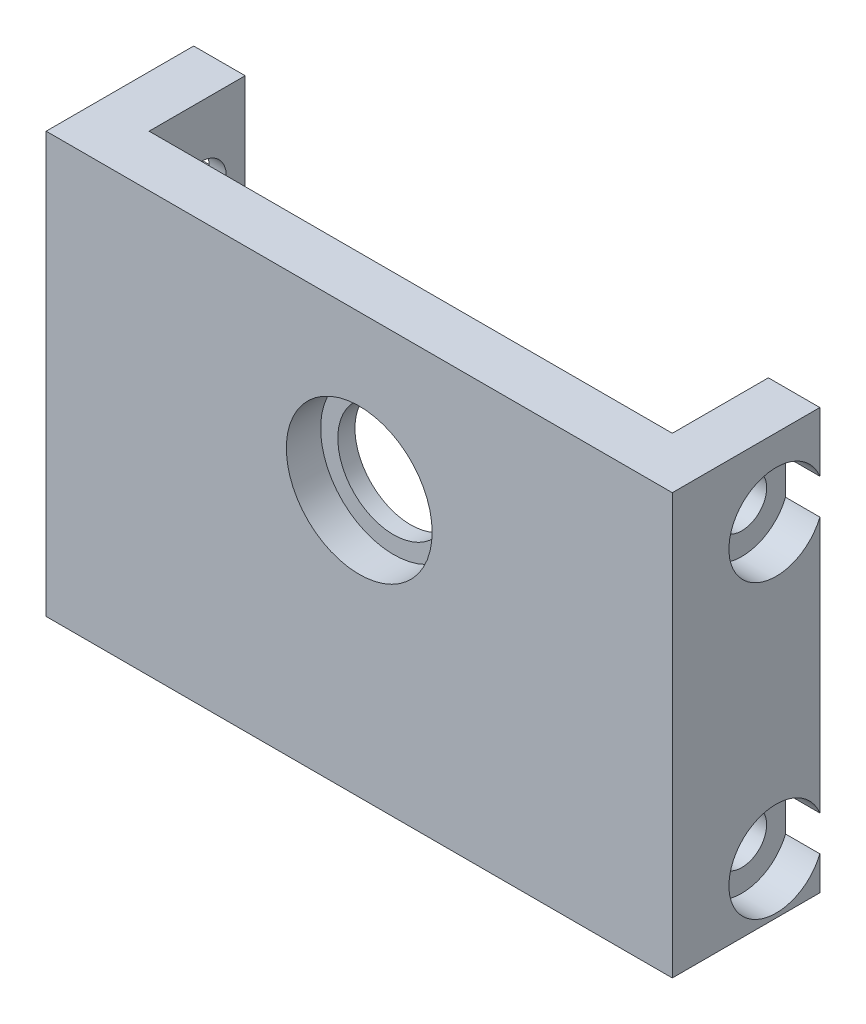
ISO-10303-21;
HEADER;
FILE_DESCRIPTION(('STEP AP214'),'2;1');
FILE_NAME('part.step','',(''),(''),'','','');
FILE_SCHEMA(('AUTOMOTIVE_DESIGN { 1 0 10303 214 1 1 1 1 }'));
ENDSEC;
DATA;
#1=APPLICATION_CONTEXT('core data for automotive mechanical design processes');
#2=APPLICATION_PROTOCOL_DEFINITION('international standard','automotive_design',2000,#1);
#3=PRODUCT_CONTEXT('',#1,'mechanical');
#4=PRODUCT('Part','Part','',(#3));
#5=PRODUCT_RELATED_PRODUCT_CATEGORY('part','',(#4));
#6=PRODUCT_DEFINITION_FORMATION('','',#4);
#7=PRODUCT_DEFINITION_CONTEXT('part definition',#1,'design');
#8=PRODUCT_DEFINITION('design','',#6,#7);
#9=PRODUCT_DEFINITION_SHAPE('','',#8);
#10=(LENGTH_UNIT() NAMED_UNIT(*) SI_UNIT(.MILLI.,.METRE.));
#11=(NAMED_UNIT(*) PLANE_ANGLE_UNIT() SI_UNIT($,.RADIAN.));
#12=(NAMED_UNIT(*) SI_UNIT($,.STERADIAN.) SOLID_ANGLE_UNIT());
#13=UNCERTAINTY_MEASURE_WITH_UNIT(LENGTH_MEASURE(1.E-05),#10,'distance_accuracy_value','');
#14=(GEOMETRIC_REPRESENTATION_CONTEXT(3) GLOBAL_UNCERTAINTY_ASSIGNED_CONTEXT((#13)) GLOBAL_UNIT_ASSIGNED_CONTEXT((#10,
#11,#12)) REPRESENTATION_CONTEXT('',''));
#15=CARTESIAN_POINT('',(0.,0.,0.));
#16=DIRECTION('',(0.,0.,1.));
#17=DIRECTION('',(1.,0.,0.));
#18=AXIS2_PLACEMENT_3D('',#15,#16,#17);
#19=CARTESIAN_POINT('',(33.25,0.,0.));
#20=DIRECTION('',(-1.,0.,0.));
#21=DIRECTION('',(0.,1.,0.));
#22=AXIS2_PLACEMENT_3D('',#19,#20,#21);
#23=PLANE('',#22);
#24=DIRECTION('',(0.,-1.,0.));
#25=VECTOR('',#24,1.);
#26=CARTESIAN_POINT('',(33.25,3.00000000000002,-5.34999999999999));
#27=LINE('',#26,#25);
#28=CARTESIAN_POINT('',(33.25,-2.52956301409871,-5.34999999999999));
#29=VERTEX_POINT('',#28);
#30=CARTESIAN_POINT('',(33.25,-17.4704369859013,-5.34999999999999));
#31=VERTEX_POINT('',#30);
#32=EDGE_CURVE('E59',#29,#31,#27,.T.);
#33=ORIENTED_EDGE('',*,*,#32,.F.);
#34=CARTESIAN_POINT('',(33.25,-1.50000000000002,-2.79999999999999));
#35=DIRECTION('',(1.,0.,0.));
#36=DIRECTION('',(0.,0.,-1.));
#37=AXIS2_PLACEMENT_3D('',#34,#35,#36);
#38=CIRCLE('',#37,2.75);
#39=CARTESIAN_POINT('',(33.25,-0.470436985901324,-5.34999999999999));
#40=VERTEX_POINT('',#39);
#41=EDGE_CURVE('E52',#40,#29,#38,.T.);
#42=ORIENTED_EDGE('',*,*,#41,.F.);
#43=CARTESIAN_POINT('',(33.25,3.00000000000002,-5.34999999999999));
#44=VERTEX_POINT('',#43);
#45=EDGE_CURVE('E163',#44,#40,#27,.T.);
#46=ORIENTED_EDGE('',*,*,#45,.F.);
#47=DIRECTION('',(0.,0.,-1.));
#48=VECTOR('',#47,1.);
#49=CARTESIAN_POINT('',(33.25,3.00000000000002,3.25));
#50=LINE('',#49,#48);
#51=CARTESIAN_POINT('',(33.25,3.00000000000002,3.25));
#52=VERTEX_POINT('',#51);
#53=EDGE_CURVE('E170',#52,#44,#50,.T.);
#54=ORIENTED_EDGE('',*,*,#53,.F.);
#55=DIRECTION('',(0.,1.,0.));
#56=VECTOR('',#55,1.);
#57=CARTESIAN_POINT('',(33.25,3.00000000000002,3.25));
#58=LINE('',#57,#56);
#59=CARTESIAN_POINT('',(33.25,-21.4999999999988,3.25));
#60=VERTEX_POINT('',#59);
#61=EDGE_CURVE('E180',#60,#52,#58,.T.);
#62=ORIENTED_EDGE('',*,*,#61,.F.);
#63=DIRECTION('',(0.,0.,1.));
#64=VECTOR('',#63,1.);
#65=CARTESIAN_POINT('',(33.25,-21.4999999999988,3.25));
#66=LINE('',#65,#64);
#67=CARTESIAN_POINT('',(33.25,-21.4999999999988,-5.34999999999999));
#68=VERTEX_POINT('',#67);
#69=EDGE_CURVE('E175',#68,#60,#66,.T.);
#70=ORIENTED_EDGE('',*,*,#69,.F.);
#71=CARTESIAN_POINT('',(33.25,-19.5295630140987,-5.34999999999999));
#72=VERTEX_POINT('',#71);
#73=EDGE_CURVE('E172',#72,#68,#27,.T.);
#74=ORIENTED_EDGE('',*,*,#73,.F.);
#75=CARTESIAN_POINT('',(33.25,-18.5,-2.79999999999999));
#76=DIRECTION('',(1.,0.,0.));
#77=DIRECTION('',(0.,0.,-1.));
#78=AXIS2_PLACEMENT_3D('',#75,#76,#77);
#79=CIRCLE('',#78,2.75);
#80=EDGE_CURVE('E234',#31,#72,#79,.T.);
#81=ORIENTED_EDGE('',*,*,#80,.F.);
#82=EDGE_LOOP('',(#33,#42,#46,#54,#62,#70,#74,#81));
#83=FACE_BOUND('',#82,.T.);
#84=ADVANCED_FACE('F38',(#83),#23,.F.);
#85=CARTESIAN_POINT('',(-3.25,0.,0.));
#86=DIRECTION('',(1.,0.,0.));
#87=DIRECTION('',(0.,1.,0.));
#88=AXIS2_PLACEMENT_3D('',#85,#86,#87);
#89=PLANE('',#88);
#90=DIRECTION('',(0.,-1.,0.));
#91=VECTOR('',#90,1.);
#92=CARTESIAN_POINT('',(-3.25,3.00000000000002,-5.34999999999999));
#93=LINE('',#92,#91);
#94=CARTESIAN_POINT('',(-3.25,3.00000000000002,-5.34999999999999));
#95=VERTEX_POINT('',#94);
#96=CARTESIAN_POINT('',(-3.25,-0.470436985901327,-5.34999999999999));
#97=VERTEX_POINT('',#96);
#98=EDGE_CURVE('E377',#95,#97,#93,.T.);
#99=ORIENTED_EDGE('',*,*,#98,.T.);
#100=CARTESIAN_POINT('',(-3.25,-1.50000000000001,-2.79999999999999));
#101=DIRECTION('',(-1.,0.,0.));
#102=DIRECTION('',(0.,0.,1.));
#103=AXIS2_PLACEMENT_3D('',#100,#101,#102);
#104=CIRCLE('',#103,2.75);
#105=CARTESIAN_POINT('',(-3.25,-2.52956301409871,-5.34999999999999));
#106=VERTEX_POINT('',#105);
#107=EDGE_CURVE('E219',#106,#97,#104,.T.);
#108=ORIENTED_EDGE('',*,*,#107,.F.);
#109=CARTESIAN_POINT('',(-3.25,-17.4704369859013,-5.34999999999999));
#110=VERTEX_POINT('',#109);
#111=EDGE_CURVE('E378',#106,#110,#93,.T.);
#112=ORIENTED_EDGE('',*,*,#111,.T.);
#113=CARTESIAN_POINT('',(-3.25,-18.5,-2.79999999999999));
#114=DIRECTION('',(-1.,0.,0.));
#115=DIRECTION('',(0.,0.,1.));
#116=AXIS2_PLACEMENT_3D('',#113,#114,#115);
#117=CIRCLE('',#116,2.75);
#118=CARTESIAN_POINT('',(-3.25,-19.5295630140987,-5.34999999999999));
#119=VERTEX_POINT('',#118);
#120=EDGE_CURVE('E207',#119,#110,#117,.T.);
#121=ORIENTED_EDGE('',*,*,#120,.F.);
#122=CARTESIAN_POINT('',(-3.25,-21.4999999999988,-5.34999999999999));
#123=VERTEX_POINT('',#122);
#124=EDGE_CURVE('E375',#119,#123,#93,.T.);
#125=ORIENTED_EDGE('',*,*,#124,.T.);
#126=DIRECTION('',(0.,0.,1.));
#127=VECTOR('',#126,1.);
#128=CARTESIAN_POINT('',(-3.25,-21.4999999999988,3.25));
#129=LINE('',#128,#127);
#130=CARTESIAN_POINT('',(-3.25,-21.4999999999988,3.25));
#131=VERTEX_POINT('',#130);
#132=EDGE_CURVE('E322',#123,#131,#129,.T.);
#133=ORIENTED_EDGE('',*,*,#132,.T.);
#134=DIRECTION('',(0.,1.,0.));
#135=VECTOR('',#134,1.);
#136=CARTESIAN_POINT('',(-3.25,3.00000000000002,3.25));
#137=LINE('',#136,#135);
#138=CARTESIAN_POINT('',(-3.25,3.00000000000002,3.25));
#139=VERTEX_POINT('',#138);
#140=EDGE_CURVE('E326',#131,#139,#137,.T.);
#141=ORIENTED_EDGE('',*,*,#140,.T.);
#142=DIRECTION('',(0.,0.,-1.));
#143=VECTOR('',#142,1.);
#144=CARTESIAN_POINT('',(-3.25,3.00000000000002,3.25));
#145=LINE('',#144,#143);
#146=EDGE_CURVE('E382',#139,#95,#145,.T.);
#147=ORIENTED_EDGE('',*,*,#146,.T.);
#148=EDGE_LOOP('',(#99,#108,#112,#121,#125,#133,#141,#147));
#149=FACE_BOUND('',#148,.T.);
#150=ADVANCED_FACE('F255',(#149),#89,.F.);
#151=CARTESIAN_POINT('',(-0.249999999999998,-21.4999999999988,3.25));
#152=DIRECTION('',(0.,1.,0.));
#153=DIRECTION('',(0.,0.,1.));
#154=AXIS2_PLACEMENT_3D('',#151,#152,#153);
#155=PLANE('',#154);
#156=DIRECTION('',(1.,0.,0.));
#157=VECTOR('',#156,1.);
#158=CARTESIAN_POINT('',(-0.249999999999998,-21.4999999999988,0.25));
#159=LINE('',#158,#157);
#160=CARTESIAN_POINT('',(-0.249999999999998,-21.4999999999988,0.25));
#161=VERTEX_POINT('',#160);
#162=CARTESIAN_POINT('',(30.25,-21.4999999999988,0.25));
#163=VERTEX_POINT('',#162);
#164=EDGE_CURVE('E308',#161,#163,#159,.T.);
#165=ORIENTED_EDGE('',*,*,#164,.T.);
#166=DIRECTION('',(0.,0.,1.));
#167=VECTOR('',#166,1.);
#168=CARTESIAN_POINT('',(30.25,-21.4999999999988,3.25));
#169=LINE('',#168,#167);
#170=CARTESIAN_POINT('',(30.25,-21.4999999999988,-5.34999999999999));
#171=VERTEX_POINT('',#170);
#172=EDGE_CURVE('E190',#171,#163,#169,.T.);
#173=ORIENTED_EDGE('',*,*,#172,.F.);
#174=DIRECTION('',(-1.,0.,0.));
#175=VECTOR('',#174,1.);
#176=CARTESIAN_POINT('',(33.25,-21.4999999999988,-5.34999999999999));
#177=LINE('',#176,#175);
#178=EDGE_CURVE('E316',#68,#171,#177,.T.);
#179=ORIENTED_EDGE('',*,*,#178,.F.);
#180=ORIENTED_EDGE('',*,*,#69,.T.);
#181=DIRECTION('',(1.,0.,0.));
#182=VECTOR('',#181,1.);
#183=CARTESIAN_POINT('',(-0.249999999999998,-21.4999999999988,3.25));
#184=LINE('',#183,#182);
#185=EDGE_CURVE('E303',#131,#60,#184,.T.);
#186=ORIENTED_EDGE('',*,*,#185,.F.);
#187=ORIENTED_EDGE('',*,*,#132,.F.);
#188=DIRECTION('',(1.,0.,0.));
#189=VECTOR('',#188,1.);
#190=CARTESIAN_POINT('',(-3.25,-21.4999999999988,-5.34999999999999));
#191=LINE('',#190,#189);
#192=CARTESIAN_POINT('',(-0.249999999999998,-21.4999999999988,-5.34999999999999));
#193=VERTEX_POINT('',#192);
#194=EDGE_CURVE('E327',#123,#193,#191,.T.);
#195=ORIENTED_EDGE('',*,*,#194,.T.);
#196=DIRECTION('',(0.,0.,1.));
#197=VECTOR('',#196,1.);
#198=CARTESIAN_POINT('',(-0.249999999999998,-21.4999999999988,3.25));
#199=LINE('',#198,#197);
#200=EDGE_CURVE('E318',#193,#161,#199,.T.);
#201=ORIENTED_EDGE('',*,*,#200,.T.);
#202=EDGE_LOOP('',(#165,#173,#179,#180,#186,#187,#195,#201));
#203=FACE_BOUND('',#202,.T.);
#204=ADVANCED_FACE('F40',(#203),#155,.F.);
#205=CARTESIAN_POINT('',(-0.250000000000001,3.00000000000002,3.25));
#206=DIRECTION('',(0.,-1.,0.));
#207=DIRECTION('',(0.,0.,-1.));
#208=AXIS2_PLACEMENT_3D('',#205,#206,#207);
#209=PLANE('',#208);
#210=DIRECTION('',(-1.,0.,0.));
#211=VECTOR('',#210,1.);
#212=CARTESIAN_POINT('',(-0.250000000000001,3.00000000000002,0.25));
#213=LINE('',#212,#211);
#214=CARTESIAN_POINT('',(30.25,3.00000000000002,0.25));
#215=VERTEX_POINT('',#214);
#216=CARTESIAN_POINT('',(-0.250000000000001,3.00000000000002,0.25));
#217=VERTEX_POINT('',#216);
#218=EDGE_CURVE('E294',#215,#217,#213,.T.);
#219=ORIENTED_EDGE('',*,*,#218,.T.);
#220=DIRECTION('',(0.,0.,-1.));
#221=VECTOR('',#220,1.);
#222=CARTESIAN_POINT('',(-0.250000000000001,3.00000000000002,3.25));
#223=LINE('',#222,#221);
#224=CARTESIAN_POINT('',(-0.250000000000001,3.00000000000002,-5.34999999999999));
#225=VERTEX_POINT('',#224);
#226=EDGE_CURVE('E298',#217,#225,#223,.T.);
#227=ORIENTED_EDGE('',*,*,#226,.T.);
#228=DIRECTION('',(1.,0.,0.));
#229=VECTOR('',#228,1.);
#230=CARTESIAN_POINT('',(-3.25,3.00000000000002,-5.34999999999999));
#231=LINE('',#230,#229);
#232=EDGE_CURVE('E312',#95,#225,#231,.T.);
#233=ORIENTED_EDGE('',*,*,#232,.F.);
#234=ORIENTED_EDGE('',*,*,#146,.F.);
#235=DIRECTION('',(-1.,0.,0.));
#236=VECTOR('',#235,1.);
#237=CARTESIAN_POINT('',(-0.250000000000001,3.00000000000002,3.25));
#238=LINE('',#237,#236);
#239=EDGE_CURVE('E332',#52,#139,#238,.T.);
#240=ORIENTED_EDGE('',*,*,#239,.F.);
#241=ORIENTED_EDGE('',*,*,#53,.T.);
#242=DIRECTION('',(-1.,0.,0.));
#243=VECTOR('',#242,1.);
#244=CARTESIAN_POINT('',(33.25,3.00000000000002,-5.34999999999999));
#245=LINE('',#244,#243);
#246=CARTESIAN_POINT('',(30.25,3.00000000000002,-5.34999999999999));
#247=VERTEX_POINT('',#246);
#248=EDGE_CURVE('E166',#44,#247,#245,.T.);
#249=ORIENTED_EDGE('',*,*,#248,.T.);
#250=DIRECTION('',(0.,0.,-1.));
#251=VECTOR('',#250,1.);
#252=CARTESIAN_POINT('',(30.25,3.00000000000002,3.25));
#253=LINE('',#252,#251);
#254=EDGE_CURVE('E184',#215,#247,#253,.T.);
#255=ORIENTED_EDGE('',*,*,#254,.F.);
#256=EDGE_LOOP('',(#219,#227,#233,#234,#240,#241,#249,#255));
#257=FACE_BOUND('',#256,.T.);
#258=ADVANCED_FACE('F284',(#257),#209,.F.);
#259=CARTESIAN_POINT('',(0.,0.,3.25));
#260=DIRECTION('',(0.,0.,1.));
#261=DIRECTION('',(1.,0.,0.));
#262=AXIS2_PLACEMENT_3D('',#259,#260,#261);
#263=PLANE('',#262);
#264=CARTESIAN_POINT('',(15.,-6.00000000000003,3.25));
#265=DIRECTION('',(0.,0.,1.));
#266=DIRECTION('',(1.,0.,0.));
#267=AXIS2_PLACEMENT_3D('',#264,#265,#266);
#268=CIRCLE('',#267,4.25000000000001);
#269=CARTESIAN_POINT('',(19.25,-6.00000000000003,3.25));
#270=VERTEX_POINT('',#269);
#271=EDGE_CURVE('E191',#270,#270,#268,.T.);
#272=ORIENTED_EDGE('',*,*,#271,.F.);
#273=EDGE_LOOP('',(#272));
#274=FACE_BOUND('',#273,.T.);
#275=ORIENTED_EDGE('',*,*,#239,.T.);
#276=ORIENTED_EDGE('',*,*,#140,.F.);
#277=ORIENTED_EDGE('',*,*,#185,.T.);
#278=ORIENTED_EDGE('',*,*,#61,.T.);
#279=EDGE_LOOP('',(#275,#276,#277,#278));
#280=FACE_BOUND('',#279,.T.);
#281=ADVANCED_FACE('F281',(#274,#280),#263,.T.);
#282=CARTESIAN_POINT('',(0.,0.,0.25));
#283=DIRECTION('',(0.,0.,1.));
#284=DIRECTION('',(1.,0.,0.));
#285=AXIS2_PLACEMENT_3D('',#282,#283,#284);
#286=PLANE('',#285);
#287=CARTESIAN_POINT('',(15.,-6.00000000000003,0.25));
#288=DIRECTION('',(0.,0.,1.));
#289=DIRECTION('',(1.,0.,0.));
#290=AXIS2_PLACEMENT_3D('',#287,#288,#289);
#291=CIRCLE('',#290,3.25);
#292=CARTESIAN_POINT('',(18.25,-6.00000000000003,0.25));
#293=VERTEX_POINT('',#292);
#294=EDGE_CURVE('E194',#293,#293,#291,.T.);
#295=ORIENTED_EDGE('',*,*,#294,.T.);
#296=EDGE_LOOP('',(#295));
#297=FACE_BOUND('',#296,.T.);
#298=DIRECTION('',(0.,-1.,0.));
#299=VECTOR('',#298,1.);
#300=CARTESIAN_POINT('',(-0.250000000000001,3.00000000000002,0.25));
#301=LINE('',#300,#299);
#302=EDGE_CURVE('E307',#217,#161,#301,.T.);
#303=ORIENTED_EDGE('',*,*,#302,.F.);
#304=ORIENTED_EDGE('',*,*,#218,.F.);
#305=DIRECTION('',(0.,1.,0.));
#306=VECTOR('',#305,1.);
#307=CARTESIAN_POINT('',(30.25,3.00000000000002,0.25));
#308=LINE('',#307,#306);
#309=EDGE_CURVE('E304',#163,#215,#308,.T.);
#310=ORIENTED_EDGE('',*,*,#309,.F.);
#311=ORIENTED_EDGE('',*,*,#164,.F.);
#312=EDGE_LOOP('',(#303,#304,#310,#311));
#313=FACE_BOUND('',#312,.T.);
#314=ADVANCED_FACE('F279',(#297,#313),#286,.F.);
#315=CARTESIAN_POINT('',(-3.25,3.00000000000002,-5.34999999999999));
#316=DIRECTION('',(0.,0.,1.));
#317=DIRECTION('',(0.,-1.,0.));
#318=AXIS2_PLACEMENT_3D('',#315,#316,#317);
#319=PLANE('',#318);
#320=DIRECTION('',(0.,1.,0.));
#321=VECTOR('',#320,1.);
#322=CARTESIAN_POINT('',(-1.25,3.00000000000002,-5.34999999999999));
#323=LINE('',#322,#321);
#324=CARTESIAN_POINT('',(-1.25,-2.52956301409871,-5.34999999999999));
#325=VERTEX_POINT('',#324);
#326=CARTESIAN_POINT('',(-1.25,-0.470436985901319,-5.34999999999999));
#327=VERTEX_POINT('',#326);
#328=EDGE_CURVE('E350',#325,#327,#323,.T.);
#329=ORIENTED_EDGE('',*,*,#328,.T.);
#330=DIRECTION('',(-1.,0.,0.));
#331=VECTOR('',#330,1.);
#332=CARTESIAN_POINT('',(-3.25,-0.470436985901323,-5.34999999999999));
#333=LINE('',#332,#331);
#334=EDGE_CURVE('E353',#327,#97,#333,.T.);
#335=ORIENTED_EDGE('',*,*,#334,.T.);
#336=ORIENTED_EDGE('',*,*,#98,.F.);
#337=ORIENTED_EDGE('',*,*,#232,.T.);
#338=DIRECTION('',(0.,-1.,0.));
#339=VECTOR('',#338,1.);
#340=CARTESIAN_POINT('',(-0.250000000000001,3.00000000000002,-5.34999999999999));
#341=LINE('',#340,#339);
#342=EDGE_CURVE('E315',#225,#193,#341,.T.);
#343=ORIENTED_EDGE('',*,*,#342,.T.);
#344=ORIENTED_EDGE('',*,*,#194,.F.);
#345=ORIENTED_EDGE('',*,*,#124,.F.);
#346=DIRECTION('',(-1.,0.,0.));
#347=VECTOR('',#346,1.);
#348=CARTESIAN_POINT('',(-3.25,-19.5295630140987,-5.34999999999999));
#349=LINE('',#348,#347);
#350=CARTESIAN_POINT('',(-1.25,-19.5295630140987,-5.34999999999999));
#351=VERTEX_POINT('',#350);
#352=EDGE_CURVE('E333',#119,#351,#349,.F.);
#353=ORIENTED_EDGE('',*,*,#352,.T.);
#354=DIRECTION('',(0.,1.,0.));
#355=VECTOR('',#354,1.);
#356=CARTESIAN_POINT('',(-1.25,3.00000000000002,-5.34999999999999));
#357=LINE('',#356,#355);
#358=CARTESIAN_POINT('',(-1.25,-17.4704369859013,-5.34999999999999));
#359=VERTEX_POINT('',#358);
#360=EDGE_CURVE('E341',#351,#359,#357,.T.);
#361=ORIENTED_EDGE('',*,*,#360,.T.);
#362=DIRECTION('',(-1.,0.,0.));
#363=VECTOR('',#362,1.);
#364=CARTESIAN_POINT('',(-3.25,-17.4704369859013,-5.34999999999999));
#365=LINE('',#364,#363);
#366=EDGE_CURVE('E344',#359,#110,#365,.T.);
#367=ORIENTED_EDGE('',*,*,#366,.T.);
#368=ORIENTED_EDGE('',*,*,#111,.F.);
#369=DIRECTION('',(-1.,0.,0.));
#370=VECTOR('',#369,1.);
#371=CARTESIAN_POINT('',(-3.25,-2.52956301409871,-5.34999999999999));
#372=LINE('',#371,#370);
#373=EDGE_CURVE('E347',#106,#325,#372,.F.);
#374=ORIENTED_EDGE('',*,*,#373,.T.);
#375=EDGE_LOOP('',(#329,#335,#336,#337,#343,#344,#345,#353,#361,#367,#368,#374));
#376=FACE_BOUND('',#375,.T.);
#377=ADVANCED_FACE('F275',(#376),#319,.F.);
#378=CARTESIAN_POINT('',(-0.25,0.,0.));
#379=DIRECTION('',(1.,0.,0.));
#380=DIRECTION('',(0.,1.,0.));
#381=AXIS2_PLACEMENT_3D('',#378,#379,#380);
#382=PLANE('',#381);
#383=CARTESIAN_POINT('',(-0.25,-1.50000000000001,-2.79999999999999));
#384=DIRECTION('',(1.,0.,0.));
#385=DIRECTION('',(0.,1.,0.));
#386=AXIS2_PLACEMENT_3D('',#383,#384,#385);
#387=CIRCLE('',#386,1.45);
#388=CARTESIAN_POINT('',(-0.25,-0.0500000000000149,-2.79999999999999));
#389=VERTEX_POINT('',#388);
#390=EDGE_CURVE('E210',#389,#389,#387,.T.);
#391=ORIENTED_EDGE('',*,*,#390,.F.);
#392=EDGE_LOOP('',(#391));
#393=FACE_BOUND('',#392,.T.);
#394=CARTESIAN_POINT('',(-0.249999999999998,-18.5,-2.79999999999999));
#395=DIRECTION('',(1.,0.,0.));
#396=DIRECTION('',(0.,1.,0.));
#397=AXIS2_PLACEMENT_3D('',#394,#395,#396);
#398=CIRCLE('',#397,1.45);
#399=CARTESIAN_POINT('',(-0.249999999999998,-17.05,-2.79999999999999));
#400=VERTEX_POINT('',#399);
#401=EDGE_CURVE('E198',#400,#400,#398,.T.);
#402=ORIENTED_EDGE('',*,*,#401,.F.);
#403=EDGE_LOOP('',(#402));
#404=FACE_BOUND('',#403,.T.);
#405=ORIENTED_EDGE('',*,*,#226,.F.);
#406=ORIENTED_EDGE('',*,*,#302,.T.);
#407=ORIENTED_EDGE('',*,*,#200,.F.);
#408=ORIENTED_EDGE('',*,*,#342,.F.);
#409=EDGE_LOOP('',(#405,#406,#407,#408));
#410=FACE_BOUND('',#409,.T.);
#411=ADVANCED_FACE('F271',(#393,#404,#410),#382,.T.);
#412=CARTESIAN_POINT('',(33.25,3.00000000000002,-5.34999999999999));
#413=DIRECTION('',(0.,0.,-1.));
#414=DIRECTION('',(0.,1.,0.));
#415=AXIS2_PLACEMENT_3D('',#412,#413,#414);
#416=PLANE('',#415);
#417=DIRECTION('',(1.,0.,0.));
#418=VECTOR('',#417,1.);
#419=CARTESIAN_POINT('',(33.25,-0.470436985901324,-5.34999999999999));
#420=LINE('',#419,#418);
#421=CARTESIAN_POINT('',(31.25,-0.470436985901319,-5.34999999999999));
#422=VERTEX_POINT('',#421);
#423=EDGE_CURVE('E12',#422,#40,#420,.T.);
#424=ORIENTED_EDGE('',*,*,#423,.F.);
#425=DIRECTION('',(0.,1.,0.));
#426=VECTOR('',#425,1.);
#427=CARTESIAN_POINT('',(31.25,3.00000000000002,-5.34999999999999));
#428=LINE('',#427,#426);
#429=CARTESIAN_POINT('',(31.25,-2.52956301409871,-5.35));
#430=VERTEX_POINT('',#429);
#431=EDGE_CURVE('E46',#430,#422,#428,.T.);
#432=ORIENTED_EDGE('',*,*,#431,.F.);
#433=DIRECTION('',(1.,0.,0.));
#434=VECTOR('',#433,1.);
#435=CARTESIAN_POINT('',(33.25,-2.52956301409871,-5.34999999999999));
#436=LINE('',#435,#434);
#437=EDGE_CURVE('E156',#29,#430,#436,.F.);
#438=ORIENTED_EDGE('',*,*,#437,.F.);
#439=ORIENTED_EDGE('',*,*,#32,.T.);
#440=DIRECTION('',(1.,0.,0.));
#441=VECTOR('',#440,1.);
#442=CARTESIAN_POINT('',(33.25,-17.4704369859013,-5.34999999999999));
#443=LINE('',#442,#441);
#444=CARTESIAN_POINT('',(31.25,-17.4704369859013,-5.34999999999999));
#445=VERTEX_POINT('',#444);
#446=EDGE_CURVE('E221',#445,#31,#443,.T.);
#447=ORIENTED_EDGE('',*,*,#446,.F.);
#448=DIRECTION('',(0.,1.,0.));
#449=VECTOR('',#448,1.);
#450=CARTESIAN_POINT('',(31.25,3.00000000000002,-5.34999999999999));
#451=LINE('',#450,#449);
#452=CARTESIAN_POINT('',(31.25,-19.5295630140987,-5.34999999999999));
#453=VERTEX_POINT('',#452);
#454=EDGE_CURVE('E356',#453,#445,#451,.T.);
#455=ORIENTED_EDGE('',*,*,#454,.F.);
#456=DIRECTION('',(1.,0.,0.));
#457=VECTOR('',#456,1.);
#458=CARTESIAN_POINT('',(33.25,-19.5295630140987,-5.34999999999999));
#459=LINE('',#458,#457);
#460=EDGE_CURVE('E223',#72,#453,#459,.F.);
#461=ORIENTED_EDGE('',*,*,#460,.F.);
#462=ORIENTED_EDGE('',*,*,#73,.T.);
#463=ORIENTED_EDGE('',*,*,#178,.T.);
#464=DIRECTION('',(0.,-1.,0.));
#465=VECTOR('',#464,1.);
#466=CARTESIAN_POINT('',(30.25,3.00000000000002,-5.34999999999999));
#467=LINE('',#466,#465);
#468=EDGE_CURVE('E387',#247,#171,#467,.T.);
#469=ORIENTED_EDGE('',*,*,#468,.F.);
#470=ORIENTED_EDGE('',*,*,#248,.F.);
#471=ORIENTED_EDGE('',*,*,#45,.T.);
#472=EDGE_LOOP('',(#424,#432,#438,#439,#447,#455,#461,#462,#463,#469,#470,#471));
#473=FACE_BOUND('',#472,.T.);
#474=ADVANCED_FACE('F161',(#473),#416,.T.);
#475=CARTESIAN_POINT('',(30.25,0.,0.));
#476=DIRECTION('',(-1.,0.,0.));
#477=DIRECTION('',(0.,1.,0.));
#478=AXIS2_PLACEMENT_3D('',#475,#476,#477);
#479=PLANE('',#478);
#480=CARTESIAN_POINT('',(30.25,-1.50000000000002,-2.79999999999999));
#481=DIRECTION('',(-1.,0.,0.));
#482=DIRECTION('',(0.,-1.,0.));
#483=AXIS2_PLACEMENT_3D('',#480,#481,#482);
#484=CIRCLE('',#483,1.45);
#485=CARTESIAN_POINT('',(30.25,-2.95000000000002,-2.79999999999999));
#486=VERTEX_POINT('',#485);
#487=EDGE_CURVE('E236',#486,#486,#484,.T.);
#488=ORIENTED_EDGE('',*,*,#487,.F.);
#489=EDGE_LOOP('',(#488));
#490=FACE_BOUND('',#489,.T.);
#491=CARTESIAN_POINT('',(30.25,-18.5,-2.79999999999999));
#492=DIRECTION('',(-1.,0.,0.));
#493=DIRECTION('',(0.,-1.,0.));
#494=AXIS2_PLACEMENT_3D('',#491,#492,#493);
#495=CIRCLE('',#494,1.45);
#496=CARTESIAN_POINT('',(30.25,-19.95,-2.79999999999999));
#497=VERTEX_POINT('',#496);
#498=EDGE_CURVE('E225',#497,#497,#495,.T.);
#499=ORIENTED_EDGE('',*,*,#498,.F.);
#500=EDGE_LOOP('',(#499));
#501=FACE_BOUND('',#500,.T.);
#502=ORIENTED_EDGE('',*,*,#172,.T.);
#503=ORIENTED_EDGE('',*,*,#309,.T.);
#504=ORIENTED_EDGE('',*,*,#254,.T.);
#505=ORIENTED_EDGE('',*,*,#468,.T.);
#506=EDGE_LOOP('',(#502,#503,#504,#505));
#507=FACE_BOUND('',#506,.T.);
#508=ADVANCED_FACE('F266',(#490,#501,#507),#479,.T.);
#509=CARTESIAN_POINT('',(15.,-6.00000000000003,-11.7708152801713));
#510=DIRECTION('',(0.,0.,1.));
#511=DIRECTION('',(1.,0.,0.));
#512=AXIS2_PLACEMENT_3D('',#509,#510,#511);
#513=CYLINDRICAL_SURFACE('',#512,4.25000000000001);
#514=CARTESIAN_POINT('',(15.,-6.00000000000003,1.25));
#515=DIRECTION('',(0.,0.,1.));
#516=DIRECTION('',(1.,0.,0.));
#517=AXIS2_PLACEMENT_3D('',#514,#515,#516);
#518=CIRCLE('',#517,4.25000000000001);
#519=CARTESIAN_POINT('',(19.25,-6.00000000000003,1.25));
#520=VERTEX_POINT('',#519);
#521=EDGE_CURVE('E187',#520,#520,#518,.F.);
#522=CARTESIAN_POINT('',(19.25,-6.00000000000003,1.25));
#523=CARTESIAN_POINT('',(19.25,-6.00000000000003,1.27083333333333));
#524=CARTESIAN_POINT('',(19.25,-6.00000000000003,1.29166666666667));
#525=CARTESIAN_POINT('',(19.25,-6.00000000000003,1.33333333333333));
#526=CARTESIAN_POINT('',(19.25,-6.00000000000003,1.35416666666667));
#527=CARTESIAN_POINT('',(19.25,-6.00000000000003,1.39583333333333));
#528=CARTESIAN_POINT('',(19.25,-6.00000000000003,1.41666666666667));
#529=CARTESIAN_POINT('',(19.25,-6.00000000000003,1.45833333333333));
#530=CARTESIAN_POINT('',(19.25,-6.00000000000003,1.47916666666667));
#531=CARTESIAN_POINT('',(19.25,-6.00000000000003,1.52083333333333));
#532=CARTESIAN_POINT('',(19.25,-6.00000000000003,1.54166666666667));
#533=CARTESIAN_POINT('',(19.25,-6.00000000000003,1.58333333333333));
#534=CARTESIAN_POINT('',(19.25,-6.00000000000003,1.60416666666667));
#535=CARTESIAN_POINT('',(19.25,-6.00000000000003,1.64583333333333));
#536=CARTESIAN_POINT('',(19.25,-6.00000000000003,1.66666666666667));
#537=CARTESIAN_POINT('',(19.25,-6.00000000000003,1.70833333333333));
#538=CARTESIAN_POINT('',(19.25,-6.00000000000003,1.72916666666667));
#539=CARTESIAN_POINT('',(19.25,-6.00000000000003,1.77083333333333));
#540=CARTESIAN_POINT('',(19.25,-6.00000000000003,1.79166666666667));
#541=CARTESIAN_POINT('',(19.25,-6.00000000000003,1.83333333333333));
#542=CARTESIAN_POINT('',(19.25,-6.00000000000003,1.85416666666667));
#543=CARTESIAN_POINT('',(19.25,-6.00000000000003,1.89583333333333));
#544=CARTESIAN_POINT('',(19.25,-6.00000000000003,1.91666666666667));
#545=CARTESIAN_POINT('',(19.25,-6.00000000000003,1.95833333333333));
#546=CARTESIAN_POINT('',(19.25,-6.00000000000003,1.97916666666667));
#547=CARTESIAN_POINT('',(19.25,-6.00000000000003,2.02083333333333));
#548=CARTESIAN_POINT('',(19.25,-6.00000000000003,2.04166666666667));
#549=CARTESIAN_POINT('',(19.25,-6.00000000000003,2.08333333333333));
#550=CARTESIAN_POINT('',(19.25,-6.00000000000003,2.10416666666667));
#551=CARTESIAN_POINT('',(19.25,-6.00000000000003,2.14583333333333));
#552=CARTESIAN_POINT('',(19.25,-6.00000000000003,2.16666666666667));
#553=CARTESIAN_POINT('',(19.25,-6.00000000000003,2.20833333333333));
#554=CARTESIAN_POINT('',(19.25,-6.00000000000003,2.22916666666667));
#555=CARTESIAN_POINT('',(19.25,-6.00000000000003,2.27083333333333));
#556=CARTESIAN_POINT('',(19.25,-6.00000000000003,2.29166666666667));
#557=CARTESIAN_POINT('',(19.25,-6.00000000000003,2.33333333333333));
#558=CARTESIAN_POINT('',(19.25,-6.00000000000003,2.35416666666667));
#559=CARTESIAN_POINT('',(19.25,-6.00000000000003,2.39583333333333));
#560=CARTESIAN_POINT('',(19.25,-6.00000000000003,2.41666666666667));
#561=CARTESIAN_POINT('',(19.25,-6.00000000000003,2.45833333333333));
#562=CARTESIAN_POINT('',(19.25,-6.00000000000003,2.47916666666667));
#563=CARTESIAN_POINT('',(19.25,-6.00000000000003,2.52083333333333));
#564=CARTESIAN_POINT('',(19.25,-6.00000000000003,2.54166666666667));
#565=CARTESIAN_POINT('',(19.25,-6.00000000000003,2.58333333333333));
#566=CARTESIAN_POINT('',(19.25,-6.00000000000003,2.60416666666667));
#567=CARTESIAN_POINT('',(19.25,-6.00000000000003,2.64583333333333));
#568=CARTESIAN_POINT('',(19.25,-6.00000000000003,2.66666666666667));
#569=CARTESIAN_POINT('',(19.25,-6.00000000000003,2.70833333333333));
#570=CARTESIAN_POINT('',(19.25,-6.00000000000003,2.72916666666667));
#571=CARTESIAN_POINT('',(19.25,-6.00000000000003,2.77083333333333));
#572=CARTESIAN_POINT('',(19.25,-6.00000000000003,2.79166666666667));
#573=CARTESIAN_POINT('',(19.25,-6.00000000000003,2.83333333333333));
#574=CARTESIAN_POINT('',(19.25,-6.00000000000003,2.85416666666667));
#575=CARTESIAN_POINT('',(19.25,-6.00000000000003,2.89583333333333));
#576=CARTESIAN_POINT('',(19.25,-6.00000000000003,2.91666666666667));
#577=CARTESIAN_POINT('',(19.25,-6.00000000000003,2.95833333333333));
#578=CARTESIAN_POINT('',(19.25,-6.00000000000003,2.97916666666667));
#579=CARTESIAN_POINT('',(19.25,-6.00000000000003,3.02083333333333));
#580=CARTESIAN_POINT('',(19.25,-6.00000000000003,3.04166666666667));
#581=CARTESIAN_POINT('',(19.25,-6.00000000000003,3.08333333333333));
#582=CARTESIAN_POINT('',(19.25,-6.00000000000003,3.10416666666667));
#583=CARTESIAN_POINT('',(19.25,-6.00000000000003,3.14583333333333));
#584=CARTESIAN_POINT('',(19.25,-6.00000000000003,3.16666666666667));
#585=CARTESIAN_POINT('',(19.25,-6.00000000000003,3.20833333333333));
#586=CARTESIAN_POINT('',(19.25,-6.00000000000003,3.22916666666667));
#587=CARTESIAN_POINT('',(19.25,-6.00000000000003,3.25));
#588=B_SPLINE_CURVE_WITH_KNOTS('',3,(#522,#523,#524,#525,#526,#527,#528,#529,#530,#531,#532,
#533,#534,#535,#536,#537,#538,#539,#540,#541,#542,#543,#544,#545,#546,#547,#548,#549,#550,#551,
#552,#553,#554,#555,#556,#557,#558,#559,#560,#561,#562,#563,#564,#565,#566,#567,#568,#569,#570,
#571,#572,#573,#574,#575,#576,#577,#578,#579,#580,#581,#582,#583,#584,#585,#586,#587),
.UNSPECIFIED.,.F.,.F.,(4,2,2,2,2,2,2,2,2,2,2,2,2,2,2,2,2,2,2,2,2,2,2,2,2,2,2,2,2,2,2,2,4),(0.,
0.0625000000000001,0.125,0.1875,0.25,0.3125,0.375,0.4375,0.5,0.5625,0.625000000000001,
0.687500000000001,0.750000000000001,0.812500000000001,0.875000000000001,0.937500000000001,1.,
1.0625,1.125,1.1875,1.25,1.3125,1.375,1.4375,1.5,1.5625,1.625,1.6875,1.75,1.8125,1.875,1.9375,
2.),.UNSPECIFIED.);
#589=EDGE_CURVE('BSEAM264',#520,#270,#588,.T.);
#590=ORIENTED_EDGE('',*,*,#521,.T.);
#591=ORIENTED_EDGE('',*,*,#271,.T.);
#592=ORIENTED_EDGE('',*,*,#589,.T.);
#593=ORIENTED_EDGE('',*,*,#589,.F.);
#594=EDGE_LOOP('',(#590,#592,#591,#593));
#595=FACE_BOUND('',#594,.T.);
#596=ADVANCED_FACE('F264',(#595),#513,.F.);
#597=CARTESIAN_POINT('',(0.,0.,1.25));
#598=DIRECTION('',(0.,0.,1.));
#599=DIRECTION('',(1.,0.,0.));
#600=AXIS2_PLACEMENT_3D('',#597,#598,#599);
#601=PLANE('',#600);
#602=CARTESIAN_POINT('',(15.,-6.00000000000003,1.25));
#603=DIRECTION('',(0.,0.,1.));
#604=DIRECTION('',(1.,0.,0.));
#605=AXIS2_PLACEMENT_3D('',#602,#603,#604);
#606=CIRCLE('',#605,3.25);
#607=CARTESIAN_POINT('',(18.25,-6.00000000000003,1.25));
#608=VERTEX_POINT('',#607);
#609=EDGE_CURVE('E195',#608,#608,#606,.T.);
#610=ORIENTED_EDGE('',*,*,#609,.F.);
#611=EDGE_LOOP('',(#610));
#612=FACE_BOUND('',#611,.T.);
#613=ORIENTED_EDGE('',*,*,#521,.F.);
#614=EDGE_LOOP('',(#613));
#615=FACE_BOUND('',#614,.T.);
#616=ADVANCED_FACE('F414',(#612,#615),#601,.T.);
#617=CARTESIAN_POINT('',(15.,-6.00000000000003,-5.34999999999999));
#618=DIRECTION('',(0.,0.,1.));
#619=DIRECTION('',(1.,0.,0.));
#620=AXIS2_PLACEMENT_3D('',#617,#618,#619);
#621=CYLINDRICAL_SURFACE('',#620,3.25);
#622=ORIENTED_EDGE('',*,*,#609,.T.);
#623=EDGE_LOOP('',(#622));
#624=FACE_BOUND('',#623,.T.);
#625=ORIENTED_EDGE('',*,*,#294,.F.);
#626=EDGE_LOOP('',(#625));
#627=FACE_BOUND('',#626,.T.);
#628=ADVANCED_FACE('F405',(#624,#627),#621,.F.);
#629=CARTESIAN_POINT('',(-1.25,-17.05,-2.79999999999999));
#630=DIRECTION('',(1.,0.,0.));
#631=DIRECTION('',(0.,0.,-1.));
#632=AXIS2_PLACEMENT_3D('',#629,#630,#631);
#633=PLANE('',#632);
#634=CARTESIAN_POINT('',(-1.25,-18.5,-2.79999999999999));
#635=DIRECTION('',(-1.,0.,0.));
#636=DIRECTION('',(0.,0.,1.));
#637=AXIS2_PLACEMENT_3D('',#634,#635,#636);
#638=CIRCLE('',#637,1.45);
#639=CARTESIAN_POINT('',(-1.25,-18.5,-1.34999999999999));
#640=VERTEX_POINT('',#639);
#641=EDGE_CURVE('E201',#640,#640,#638,.T.);
#642=ORIENTED_EDGE('',*,*,#641,.F.);
#643=EDGE_LOOP('',(#642));
#644=FACE_BOUND('',#643,.T.);
#645=CARTESIAN_POINT('',(-1.25,-18.5,-2.79999999999999));
#646=DIRECTION('',(-1.,0.,0.));
#647=DIRECTION('',(0.,0.,1.));
#648=AXIS2_PLACEMENT_3D('',#645,#646,#647);
#649=CIRCLE('',#648,2.75);
#650=EDGE_CURVE('E204',#351,#359,#649,.T.);
#651=ORIENTED_EDGE('',*,*,#650,.T.);
#652=ORIENTED_EDGE('',*,*,#360,.F.);
#653=EDGE_LOOP('',(#651,#652));
#654=FACE_BOUND('',#653,.T.);
#655=ADVANCED_FACE('F403',(#644,#654),#633,.F.);
#656=CARTESIAN_POINT('',(-3.25,-18.5,-2.79999999999999));
#657=DIRECTION('',(-1.,0.,0.));
#658=DIRECTION('',(0.,0.,1.));
#659=AXIS2_PLACEMENT_3D('',#656,#657,#658);
#660=CYLINDRICAL_SURFACE('',#659,2.75);
#661=ORIENTED_EDGE('',*,*,#650,.F.);
#662=ORIENTED_EDGE('',*,*,#352,.F.);
#663=ORIENTED_EDGE('',*,*,#120,.T.);
#664=ORIENTED_EDGE('',*,*,#366,.F.);
#665=EDGE_LOOP('',(#661,#662,#663,#664));
#666=FACE_BOUND('',#665,.T.);
#667=ADVANCED_FACE('F400',(#666),#660,.F.);
#668=CARTESIAN_POINT('',(-3.25,-18.5,-2.79999999999999));
#669=DIRECTION('',(-1.,0.,0.));
#670=DIRECTION('',(0.,0.,1.));
#671=AXIS2_PLACEMENT_3D('',#668,#669,#670);
#672=CYLINDRICAL_SURFACE('',#671,1.45);
#673=ORIENTED_EDGE('',*,*,#641,.T.);
#674=EDGE_LOOP('',(#673));
#675=FACE_BOUND('',#674,.T.);
#676=ORIENTED_EDGE('',*,*,#401,.T.);
#677=EDGE_LOOP('',(#676));
#678=FACE_BOUND('',#677,.T.);
#679=ADVANCED_FACE('F412',(#675,#678),#672,.F.);
#680=CARTESIAN_POINT('',(-1.25,-0.0500000000000144,-2.79999999999999));
#681=DIRECTION('',(1.,0.,0.));
#682=DIRECTION('',(0.,0.,-1.));
#683=AXIS2_PLACEMENT_3D('',#680,#681,#682);
#684=PLANE('',#683);
#685=CARTESIAN_POINT('',(-1.25,-1.50000000000001,-2.79999999999999));
#686=DIRECTION('',(-1.,0.,0.));
#687=DIRECTION('',(0.,0.,1.));
#688=AXIS2_PLACEMENT_3D('',#685,#686,#687);
#689=CIRCLE('',#688,1.45);
#690=CARTESIAN_POINT('',(-1.25,-1.50000000000001,-1.34999999999999));
#691=VERTEX_POINT('',#690);
#692=EDGE_CURVE('E213',#691,#691,#689,.T.);
#693=ORIENTED_EDGE('',*,*,#692,.F.);
#694=EDGE_LOOP('',(#693));
#695=FACE_BOUND('',#694,.T.);
#696=CARTESIAN_POINT('',(-1.25,-1.50000000000001,-2.79999999999999));
#697=DIRECTION('',(-1.,0.,0.));
#698=DIRECTION('',(0.,0.,1.));
#699=AXIS2_PLACEMENT_3D('',#696,#697,#698);
#700=CIRCLE('',#699,2.75);
#701=EDGE_CURVE('E216',#325,#327,#700,.T.);
#702=ORIENTED_EDGE('',*,*,#701,.T.);
#703=ORIENTED_EDGE('',*,*,#328,.F.);
#704=EDGE_LOOP('',(#702,#703));
#705=FACE_BOUND('',#704,.T.);
#706=ADVANCED_FACE('F397',(#695,#705),#684,.F.);
#707=CARTESIAN_POINT('',(-3.25,-1.50000000000001,-2.79999999999999));
#708=DIRECTION('',(-1.,0.,0.));
#709=DIRECTION('',(0.,0.,1.));
#710=AXIS2_PLACEMENT_3D('',#707,#708,#709);
#711=CYLINDRICAL_SURFACE('',#710,2.75);
#712=ORIENTED_EDGE('',*,*,#701,.F.);
#713=ORIENTED_EDGE('',*,*,#373,.F.);
#714=ORIENTED_EDGE('',*,*,#107,.T.);
#715=ORIENTED_EDGE('',*,*,#334,.F.);
#716=EDGE_LOOP('',(#712,#713,#714,#715));
#717=FACE_BOUND('',#716,.T.);
#718=ADVANCED_FACE('F395',(#717),#711,.F.);
#719=CARTESIAN_POINT('',(-3.25,-1.50000000000001,-2.79999999999999));
#720=DIRECTION('',(-1.,0.,0.));
#721=DIRECTION('',(0.,0.,1.));
#722=AXIS2_PLACEMENT_3D('',#719,#720,#721);
#723=CYLINDRICAL_SURFACE('',#722,1.45);
#724=ORIENTED_EDGE('',*,*,#692,.T.);
#725=EDGE_LOOP('',(#724));
#726=FACE_BOUND('',#725,.T.);
#727=ORIENTED_EDGE('',*,*,#390,.T.);
#728=EDGE_LOOP('',(#727));
#729=FACE_BOUND('',#728,.T.);
#730=ADVANCED_FACE('F529',(#726,#729),#723,.F.);
#731=CARTESIAN_POINT('',(33.25,-18.5,-2.79999999999999));
#732=DIRECTION('',(1.,0.,0.));
#733=DIRECTION('',(0.,0.,-1.));
#734=AXIS2_PLACEMENT_3D('',#731,#732,#733);
#735=CYLINDRICAL_SURFACE('',#734,1.45);
#736=CARTESIAN_POINT('',(31.25,-18.5,-2.79999999999999));
#737=DIRECTION('',(1.,0.,0.));
#738=DIRECTION('',(0.,0.,-1.));
#739=AXIS2_PLACEMENT_3D('',#736,#737,#738);
#740=CIRCLE('',#739,1.45);
#741=CARTESIAN_POINT('',(31.25,-18.5,-4.24999999999999));
#742=VERTEX_POINT('',#741);
#743=EDGE_CURVE('E228',#742,#742,#740,.T.);
#744=ORIENTED_EDGE('',*,*,#743,.T.);
#745=EDGE_LOOP('',(#744));
#746=FACE_BOUND('',#745,.T.);
#747=ORIENTED_EDGE('',*,*,#498,.T.);
#748=EDGE_LOOP('',(#747));
#749=FACE_BOUND('',#748,.T.);
#750=ADVANCED_FACE('F537',(#746,#749),#735,.F.);
#751=CARTESIAN_POINT('',(31.25,-17.05,-2.79999999999999));
#752=DIRECTION('',(-1.,0.,0.));
#753=DIRECTION('',(0.,0.,1.));
#754=AXIS2_PLACEMENT_3D('',#751,#752,#753);
#755=PLANE('',#754);
#756=ORIENTED_EDGE('',*,*,#454,.T.);
#757=CARTESIAN_POINT('',(31.25,-18.5,-2.79999999999999));
#758=DIRECTION('',(1.,0.,0.));
#759=DIRECTION('',(0.,0.,-1.));
#760=AXIS2_PLACEMENT_3D('',#757,#758,#759);
#761=CIRCLE('',#760,2.75);
#762=EDGE_CURVE('E231',#445,#453,#761,.T.);
#763=ORIENTED_EDGE('',*,*,#762,.T.);
#764=EDGE_LOOP('',(#756,#763));
#765=FACE_BOUND('',#764,.T.);
#766=ORIENTED_EDGE('',*,*,#743,.F.);
#767=EDGE_LOOP('',(#766));
#768=FACE_BOUND('',#767,.T.);
#769=ADVANCED_FACE('F361',(#765,#768),#755,.F.);
#770=CARTESIAN_POINT('',(33.25,-18.5,-2.79999999999999));
#771=DIRECTION('',(1.,0.,0.));
#772=DIRECTION('',(0.,0.,-1.));
#773=AXIS2_PLACEMENT_3D('',#770,#771,#772);
#774=CYLINDRICAL_SURFACE('',#773,2.75);
#775=ORIENTED_EDGE('',*,*,#446,.T.);
#776=ORIENTED_EDGE('',*,*,#80,.T.);
#777=ORIENTED_EDGE('',*,*,#460,.T.);
#778=ORIENTED_EDGE('',*,*,#762,.F.);
#779=EDGE_LOOP('',(#775,#776,#777,#778));
#780=FACE_BOUND('',#779,.T.);
#781=ADVANCED_FACE('F252',(#780),#774,.F.);
#782=CARTESIAN_POINT('',(33.25,-1.50000000000002,-2.79999999999999));
#783=DIRECTION('',(1.,0.,0.));
#784=DIRECTION('',(0.,0.,-1.));
#785=AXIS2_PLACEMENT_3D('',#782,#783,#784);
#786=CYLINDRICAL_SURFACE('',#785,1.45);
#787=CARTESIAN_POINT('',(31.25,-1.50000000000002,-2.79999999999999));
#788=DIRECTION('',(1.,0.,0.));
#789=DIRECTION('',(0.,0.,-1.));
#790=AXIS2_PLACEMENT_3D('',#787,#788,#789);
#791=CIRCLE('',#790,1.45);
#792=CARTESIAN_POINT('',(31.25,-1.50000000000002,-4.24999999999999));
#793=VERTEX_POINT('',#792);
#794=EDGE_CURVE('E158',#793,#793,#791,.T.);
#795=ORIENTED_EDGE('',*,*,#794,.T.);
#796=EDGE_LOOP('',(#795));
#797=FACE_BOUND('',#796,.T.);
#798=ORIENTED_EDGE('',*,*,#487,.T.);
#799=EDGE_LOOP('',(#798));
#800=FACE_BOUND('',#799,.T.);
#801=ADVANCED_FACE('F243',(#797,#800),#786,.F.);
#802=CARTESIAN_POINT('',(31.25,-0.0500000000000153,-2.79999999999999));
#803=DIRECTION('',(-1.,0.,0.));
#804=DIRECTION('',(0.,0.,1.));
#805=AXIS2_PLACEMENT_3D('',#802,#803,#804);
#806=PLANE('',#805);
#807=ORIENTED_EDGE('',*,*,#431,.T.);
#808=CARTESIAN_POINT('',(31.25,-1.50000000000002,-2.79999999999999));
#809=DIRECTION('',(1.,0.,0.));
#810=DIRECTION('',(0.,0.,-1.));
#811=AXIS2_PLACEMENT_3D('',#808,#809,#810);
#812=CIRCLE('',#811,2.75);
#813=EDGE_CURVE('E154',#422,#430,#812,.T.);
#814=ORIENTED_EDGE('',*,*,#813,.T.);
#815=EDGE_LOOP('',(#807,#814));
#816=FACE_BOUND('',#815,.T.);
#817=ORIENTED_EDGE('',*,*,#794,.F.);
#818=EDGE_LOOP('',(#817));
#819=FACE_BOUND('',#818,.T.);
#820=ADVANCED_FACE('F152',(#816,#819),#806,.F.);
#821=CARTESIAN_POINT('',(33.25,-1.50000000000002,-2.79999999999999));
#822=DIRECTION('',(1.,0.,0.));
#823=DIRECTION('',(0.,0.,-1.));
#824=AXIS2_PLACEMENT_3D('',#821,#822,#823);
#825=CYLINDRICAL_SURFACE('',#824,2.75);
#826=ORIENTED_EDGE('',*,*,#423,.T.);
#827=ORIENTED_EDGE('',*,*,#41,.T.);
#828=ORIENTED_EDGE('',*,*,#437,.T.);
#829=ORIENTED_EDGE('',*,*,#813,.F.);
#830=EDGE_LOOP('',(#826,#827,#828,#829));
#831=FACE_BOUND('',#830,.T.);
#832=ADVANCED_FACE('F157',(#831),#825,.F.);
#833=CLOSED_SHELL('',(#84,#150,#204,#258,#281,#314,#377,#411,#474,#508,#596,#616,#628,#655,#667,
#679,#706,#718,#730,#750,#769,#781,#801,#820,#832));
#834=MANIFOLD_SOLID_BREP('B2',#833);
#835=ADVANCED_BREP_SHAPE_REPRESENTATION('',(#18,#834),#14);
#836=SHAPE_DEFINITION_REPRESENTATION(#9,#835);
ENDSEC;
END-ISO-10303-21;
